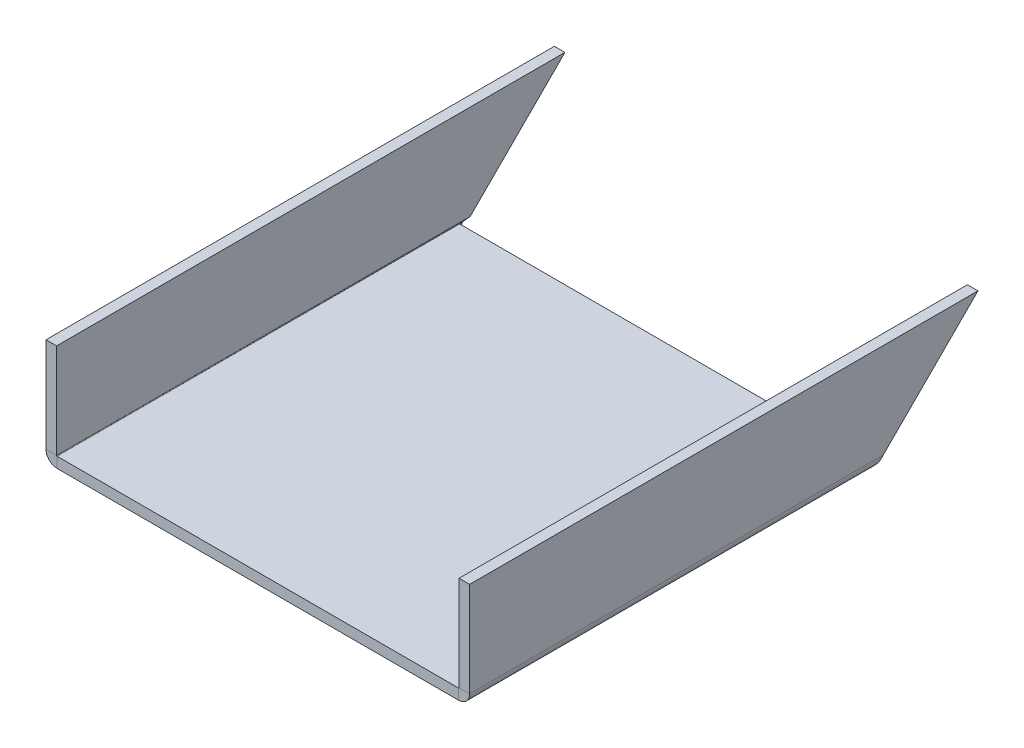
ISO-10303-21;
HEADER;
FILE_DESCRIPTION(('STEP AP214'),'2;1');
FILE_NAME('part.step','',(''),(''),'','','');
FILE_SCHEMA(('AUTOMOTIVE_DESIGN { 1 0 10303 214 1 1 1 1 }'));
ENDSEC;
DATA;
#1=APPLICATION_CONTEXT('core data for automotive mechanical design processes');
#2=APPLICATION_PROTOCOL_DEFINITION('international standard','automotive_design',2000,#1);
#3=PRODUCT_CONTEXT('',#1,'mechanical');
#4=PRODUCT('Part','Part','',(#3));
#5=PRODUCT_RELATED_PRODUCT_CATEGORY('part','',(#4));
#6=PRODUCT_DEFINITION_FORMATION('','',#4);
#7=PRODUCT_DEFINITION_CONTEXT('part definition',#1,'design');
#8=PRODUCT_DEFINITION('design','',#6,#7);
#9=PRODUCT_DEFINITION_SHAPE('','',#8);
#10=(LENGTH_UNIT() NAMED_UNIT(*) SI_UNIT(.MILLI.,.METRE.));
#11=(NAMED_UNIT(*) PLANE_ANGLE_UNIT() SI_UNIT($,.RADIAN.));
#12=(NAMED_UNIT(*) SI_UNIT($,.STERADIAN.) SOLID_ANGLE_UNIT());
#13=UNCERTAINTY_MEASURE_WITH_UNIT(LENGTH_MEASURE(1.E-05),#10,'distance_accuracy_value','');
#14=(GEOMETRIC_REPRESENTATION_CONTEXT(3) GLOBAL_UNCERTAINTY_ASSIGNED_CONTEXT((#13)) GLOBAL_UNIT_ASSIGNED_CONTEXT((#10,
#11,#12)) REPRESENTATION_CONTEXT('',''));
#15=CARTESIAN_POINT('',(0.,0.,0.));
#16=DIRECTION('',(0.,0.,1.));
#17=DIRECTION('',(1.,0.,0.));
#18=AXIS2_PLACEMENT_3D('',#15,#16,#17);
#19=CARTESIAN_POINT('',(94.6909116297961,498.,-148.));
#20=DIRECTION('',(0.,1.,0.));
#21=DIRECTION('',(-1.,0.,0.));
#22=AXIS2_PLACEMENT_3D('',#19,#20,#21);
#23=PLANE('',#22);
#24=DIRECTION('',(1.,0.,0.));
#25=VECTOR('',#24,1.);
#26=CARTESIAN_POINT('',(94.6909116297963,498.,-51.9999999999997));
#27=LINE('',#26,#25);
#28=CARTESIAN_POINT('',(288.,498.,-52.));
#29=VERTEX_POINT('',#28);
#30=CARTESIAN_POINT('',(290.,498.,-52.));
#31=VERTEX_POINT('',#30);
#32=EDGE_CURVE('E186',#29,#31,#27,.T.);
#33=ORIENTED_EDGE('',*,*,#32,.T.);
#34=DIRECTION('',(0.,0.,1.));
#35=VECTOR('',#34,1.);
#36=CARTESIAN_POINT('',(290.,498.,-148.));
#37=LINE('',#36,#35);
#38=CARTESIAN_POINT('',(290.,498.,-148.));
#39=VERTEX_POINT('',#38);
#40=EDGE_CURVE('E175',#39,#31,#37,.T.);
#41=ORIENTED_EDGE('',*,*,#40,.F.);
#42=DIRECTION('',(1.,0.,0.));
#43=VECTOR('',#42,1.);
#44=CARTESIAN_POINT('',(94.6909116297961,498.,-148.));
#45=LINE('',#44,#43);
#46=CARTESIAN_POINT('',(288.,498.,-148.));
#47=VERTEX_POINT('',#46);
#48=EDGE_CURVE('E221',#47,#39,#45,.T.);
#49=ORIENTED_EDGE('',*,*,#48,.F.);
#50=DIRECTION('',(0.,0.,1.));
#51=VECTOR('',#50,1.);
#52=CARTESIAN_POINT('',(288.,498.,-148.));
#53=LINE('',#52,#51);
#54=EDGE_CURVE('E64',#47,#29,#53,.T.);
#55=ORIENTED_EDGE('',*,*,#54,.T.);
#56=EDGE_LOOP('',(#33,#41,#49,#55));
#57=FACE_BOUND('',#56,.T.);
#58=ADVANCED_FACE('F45',(#57),#23,.T.);
#59=CARTESIAN_POINT('',(94.6909116297963,480.,-51.9999999999996));
#60=DIRECTION('',(0.,0.,1.));
#61=DIRECTION('',(0.,1.,0.));
#62=AXIS2_PLACEMENT_3D('',#59,#60,#61);
#63=PLANE('',#62);
#64=DIRECTION('',(1.,0.,0.));
#65=VECTOR('',#64,1.);
#66=CARTESIAN_POINT('',(94.6909116297963,480.1,-51.9999999999996));
#67=LINE('',#66,#65);
#68=CARTESIAN_POINT('',(288.,480.1,-51.9999999999999));
#69=VERTEX_POINT('',#68);
#70=CARTESIAN_POINT('',(290.,480.1,-51.9999999999999));
#71=VERTEX_POINT('',#70);
#72=EDGE_CURVE('E164',#69,#71,#67,.T.);
#73=ORIENTED_EDGE('',*,*,#72,.T.);
#74=DIRECTION('',(0.,1.,0.));
#75=VECTOR('',#74,1.);
#76=CARTESIAN_POINT('',(290.,478.,-51.9999999999999));
#77=LINE('',#76,#75);
#78=EDGE_CURVE('E167',#71,#31,#77,.T.);
#79=ORIENTED_EDGE('',*,*,#78,.T.);
#80=ORIENTED_EDGE('',*,*,#32,.F.);
#81=DIRECTION('',(0.,-1.,0.));
#82=VECTOR('',#81,1.);
#83=CARTESIAN_POINT('',(288.,480.,-51.9999999999999));
#84=LINE('',#83,#82);
#85=EDGE_CURVE('E169',#29,#69,#84,.T.);
#86=ORIENTED_EDGE('',*,*,#85,.T.);
#87=EDGE_LOOP('',(#73,#79,#80,#86));
#88=FACE_BOUND('',#87,.T.);
#89=ADVANCED_FACE('F165',(#88),#63,.T.);
#90=CARTESIAN_POINT('',(290.,478.,-148.));
#91=DIRECTION('',(1.,0.,0.));
#92=DIRECTION('',(0.,0.,-1.));
#93=AXIS2_PLACEMENT_3D('',#90,#91,#92);
#94=PLANE('',#93);
#95=DIRECTION('',(0.,0.,1.));
#96=VECTOR('',#95,1.);
#97=CARTESIAN_POINT('',(290.,480.1,-52.));
#98=LINE('',#97,#96);
#99=CARTESIAN_POINT('',(290.,480.1,-130.1));
#100=VERTEX_POINT('',#99);
#101=EDGE_CURVE('E87',#100,#71,#98,.T.);
#102=ORIENTED_EDGE('',*,*,#101,.F.);
#103=DIRECTION('',(0.,-0.707106781186548,0.707106781186548));
#104=VECTOR('',#103,1.);
#105=CARTESIAN_POINT('',(290.,240.,110.));
#106=LINE('',#105,#104);
#107=EDGE_CURVE('E55',#39,#100,#106,.T.);
#108=ORIENTED_EDGE('',*,*,#107,.F.);
#109=ORIENTED_EDGE('',*,*,#40,.T.);
#110=ORIENTED_EDGE('',*,*,#78,.F.);
#111=EDGE_LOOP('',(#102,#108,#109,#110));
#112=FACE_BOUND('',#111,.T.);
#113=ADVANCED_FACE('F174',(#112),#94,.T.);
#114=CARTESIAN_POINT('',(94.6909116297965,241.,109.));
#115=DIRECTION('',(0.,-0.707106781186548,-0.707106781186548));
#116=DIRECTION('',(0.,-0.707106781186548,0.707106781186548));
#117=AXIS2_PLACEMENT_3D('',#114,#115,#116);
#118=PLANE('',#117);
#119=ORIENTED_EDGE('',*,*,#48,.T.);
#120=ORIENTED_EDGE('',*,*,#107,.T.);
#121=CARTESIAN_POINT('',(288.,480.1,-130.1));
#122=CARTESIAN_POINT('',(290.,480.1,-130.1));
#123=B_SPLINE_CURVE_WITH_KNOTS('',1,(#121,#122),.UNSPECIFIED.,.F.,.F.,(2,2),(0.,1.),.UNSPECIFIED.);
#124=CARTESIAN_POINT('',(288.,480.1,-130.1));
#125=VERTEX_POINT('',#124);
#126=EDGE_CURVE('E187',#125,#100,#123,.T.);
#127=ORIENTED_EDGE('',*,*,#126,.F.);
#128=DIRECTION('',(0.,0.707106781186548,-0.707106781186548));
#129=VECTOR('',#128,1.);
#130=CARTESIAN_POINT('',(288.,241.,109.));
#131=LINE('',#130,#129);
#132=EDGE_CURVE('E12',#125,#47,#131,.T.);
#133=ORIENTED_EDGE('',*,*,#132,.T.);
#134=EDGE_LOOP('',(#119,#120,#127,#133));
#135=FACE_BOUND('',#134,.T.);
#136=ADVANCED_FACE('F476',(#135),#118,.T.);
#137=CARTESIAN_POINT('',(288.,480.,-148.));
#138=DIRECTION('',(-1.,0.,0.));
#139=DIRECTION('',(0.,0.,1.));
#140=AXIS2_PLACEMENT_3D('',#137,#138,#139);
#141=PLANE('',#140);
#142=DIRECTION('',(0.,0.,-1.));
#143=VECTOR('',#142,1.);
#144=CARTESIAN_POINT('',(288.,480.1,-52.));
#145=LINE('',#144,#143);
#146=EDGE_CURVE('E412',#69,#125,#145,.T.);
#147=ORIENTED_EDGE('',*,*,#146,.F.);
#148=ORIENTED_EDGE('',*,*,#85,.F.);
#149=ORIENTED_EDGE('',*,*,#54,.F.);
#150=ORIENTED_EDGE('',*,*,#132,.F.);
#151=EDGE_LOOP('',(#147,#148,#149,#150));
#152=FACE_BOUND('',#151,.T.);
#153=ADVANCED_FACE('F47',(#152),#141,.T.);
#154=CARTESIAN_POINT('',(405.309088370204,498.,-148.));
#155=DIRECTION('',(0.,-1.,0.));
#156=DIRECTION('',(1.,0.,0.));
#157=AXIS2_PLACEMENT_3D('',#154,#155,#156);
#158=PLANE('',#157);
#159=DIRECTION('',(0.,0.,1.));
#160=VECTOR('',#159,1.);
#161=CARTESIAN_POINT('',(210.,498.,-148.));
#162=LINE('',#161,#160);
#163=CARTESIAN_POINT('',(210.,498.,-148.));
#164=VERTEX_POINT('',#163);
#165=CARTESIAN_POINT('',(210.,498.,-52.));
#166=VERTEX_POINT('',#165);
#167=EDGE_CURVE('E307',#164,#166,#162,.T.);
#168=ORIENTED_EDGE('',*,*,#167,.T.);
#169=DIRECTION('',(-1.,0.,0.));
#170=VECTOR('',#169,1.);
#171=CARTESIAN_POINT('',(405.309088370204,498.,-51.9999999999997));
#172=LINE('',#171,#170);
#173=CARTESIAN_POINT('',(212.,498.,-52.));
#174=VERTEX_POINT('',#173);
#175=EDGE_CURVE('E300',#174,#166,#172,.T.);
#176=ORIENTED_EDGE('',*,*,#175,.F.);
#177=DIRECTION('',(0.,0.,1.));
#178=VECTOR('',#177,1.);
#179=CARTESIAN_POINT('',(212.,498.,-148.));
#180=LINE('',#179,#178);
#181=CARTESIAN_POINT('',(212.,498.,-148.));
#182=VERTEX_POINT('',#181);
#183=EDGE_CURVE('E95',#182,#174,#180,.T.);
#184=ORIENTED_EDGE('',*,*,#183,.F.);
#185=DIRECTION('',(-1.,0.,0.));
#186=VECTOR('',#185,1.);
#187=CARTESIAN_POINT('',(405.309088370204,498.,-148.));
#188=LINE('',#187,#186);
#189=EDGE_CURVE('E305',#182,#164,#188,.T.);
#190=ORIENTED_EDGE('',*,*,#189,.T.);
#191=EDGE_LOOP('',(#168,#176,#184,#190));
#192=FACE_BOUND('',#191,.T.);
#193=ADVANCED_FACE('F459',(#192),#158,.F.);
#194=CARTESIAN_POINT('',(405.309088370203,250.,100.));
#195=DIRECTION('',(0.,-0.707106781186547,-0.707106781186547));
#196=DIRECTION('',(0.,0.707106781186548,-0.707106781186548));
#197=AXIS2_PLACEMENT_3D('',#194,#195,#196);
#198=PLANE('',#197);
#199=CARTESIAN_POINT('',(210.,480.1,-130.1));
#200=CARTESIAN_POINT('',(212.,480.1,-130.1));
#201=B_SPLINE_CURVE_WITH_KNOTS('',1,(#199,#200),.UNSPECIFIED.,.F.,.F.,(2,2),(0.,1.),.UNSPECIFIED.);
#202=CARTESIAN_POINT('',(212.,480.1,-130.1));
#203=VERTEX_POINT('',#202);
#204=CARTESIAN_POINT('',(210.,480.1,-130.1));
#205=VERTEX_POINT('',#204);
#206=EDGE_CURVE('E275',#203,#205,#201,.F.);
#207=ORIENTED_EDGE('',*,*,#206,.T.);
#208=DIRECTION('',(0.,0.707106781186548,-0.707106781186548));
#209=VECTOR('',#208,1.);
#210=CARTESIAN_POINT('',(210.,250.,100.));
#211=LINE('',#210,#209);
#212=EDGE_CURVE('E270',#205,#164,#211,.T.);
#213=ORIENTED_EDGE('',*,*,#212,.T.);
#214=ORIENTED_EDGE('',*,*,#189,.F.);
#215=DIRECTION('',(0.,-0.707106781186548,0.707106781186548));
#216=VECTOR('',#215,1.);
#217=CARTESIAN_POINT('',(212.,250.,100.));
#218=LINE('',#217,#216);
#219=EDGE_CURVE('E274',#182,#203,#218,.T.);
#220=ORIENTED_EDGE('',*,*,#219,.T.);
#221=EDGE_LOOP('',(#207,#213,#214,#220));
#222=FACE_BOUND('',#221,.T.);
#223=ADVANCED_FACE('F449',(#222),#198,.T.);
#224=CARTESIAN_POINT('',(210.,498.,-148.));
#225=DIRECTION('',(-1.,0.,0.));
#226=DIRECTION('',(0.,0.,1.));
#227=AXIS2_PLACEMENT_3D('',#224,#225,#226);
#228=PLANE('',#227);
#229=DIRECTION('',(0.,0.,-1.));
#230=VECTOR('',#229,1.);
#231=CARTESIAN_POINT('',(210.,480.1,-130.1));
#232=LINE('',#231,#230);
#233=CARTESIAN_POINT('',(210.,480.1,-51.9999999999999));
#234=VERTEX_POINT('',#233);
#235=EDGE_CURVE('E119',#234,#205,#232,.T.);
#236=ORIENTED_EDGE('',*,*,#235,.F.);
#237=DIRECTION('',(0.,-1.,0.));
#238=VECTOR('',#237,1.);
#239=CARTESIAN_POINT('',(210.,498.,-51.9999999999999));
#240=LINE('',#239,#238);
#241=EDGE_CURVE('E115',#166,#234,#240,.T.);
#242=ORIENTED_EDGE('',*,*,#241,.F.);
#243=ORIENTED_EDGE('',*,*,#167,.F.);
#244=ORIENTED_EDGE('',*,*,#212,.F.);
#245=EDGE_LOOP('',(#236,#242,#243,#244));
#246=FACE_BOUND('',#245,.T.);
#247=ADVANCED_FACE('F458',(#246),#228,.T.);
#248=CARTESIAN_POINT('',(405.309088370204,498.,-51.9999999999997));
#249=DIRECTION('',(0.,0.,1.));
#250=DIRECTION('',(0.,-1.,0.));
#251=AXIS2_PLACEMENT_3D('',#248,#249,#250);
#252=PLANE('',#251);
#253=ORIENTED_EDGE('',*,*,#175,.T.);
#254=ORIENTED_EDGE('',*,*,#241,.T.);
#255=DIRECTION('',(-1.,0.,0.));
#256=VECTOR('',#255,1.);
#257=CARTESIAN_POINT('',(405.309088370204,480.1,-51.9999999999997));
#258=LINE('',#257,#256);
#259=CARTESIAN_POINT('',(212.,480.1,-51.9999999999999));
#260=VERTEX_POINT('',#259);
#261=EDGE_CURVE('E309',#260,#234,#258,.T.);
#262=ORIENTED_EDGE('',*,*,#261,.F.);
#263=DIRECTION('',(0.,1.,0.));
#264=VECTOR('',#263,1.);
#265=CARTESIAN_POINT('',(212.,498.,-51.9999999999999));
#266=LINE('',#265,#264);
#267=EDGE_CURVE('E299',#260,#174,#266,.T.);
#268=ORIENTED_EDGE('',*,*,#267,.T.);
#269=EDGE_LOOP('',(#253,#254,#262,#268));
#270=FACE_BOUND('',#269,.T.);
#271=ADVANCED_FACE('F463',(#270),#252,.T.);
#272=CARTESIAN_POINT('',(212.,498.,-148.));
#273=DIRECTION('',(1.,0.,0.));
#274=DIRECTION('',(0.,0.,-1.));
#275=AXIS2_PLACEMENT_3D('',#272,#273,#274);
#276=PLANE('',#275);
#277=DIRECTION('',(0.,0.,1.));
#278=VECTOR('',#277,1.);
#279=CARTESIAN_POINT('',(212.,480.1,-130.1));
#280=LINE('',#279,#278);
#281=EDGE_CURVE('E252',#203,#260,#280,.T.);
#282=ORIENTED_EDGE('',*,*,#281,.F.);
#283=ORIENTED_EDGE('',*,*,#219,.F.);
#284=ORIENTED_EDGE('',*,*,#183,.T.);
#285=ORIENTED_EDGE('',*,*,#267,.F.);
#286=EDGE_LOOP('',(#282,#283,#284,#285));
#287=FACE_BOUND('',#286,.T.);
#288=ADVANCED_FACE('F466',(#287),#276,.T.);
#289=CARTESIAN_POINT('',(212.,692.677805094053,-51.9999999999999));
#290=DIRECTION('',(0.,0.,1.));
#291=DIRECTION('',(1.,0.,0.));
#292=AXIS2_PLACEMENT_3D('',#289,#290,#291);
#293=PLANE('',#292);
#294=DIRECTION('',(0.,-1.,0.));
#295=VECTOR('',#294,1.);
#296=CARTESIAN_POINT('',(212.1,692.677805094053,-51.9999999999999));
#297=LINE('',#296,#295);
#298=CARTESIAN_POINT('',(212.1,480.,-51.9999999999999));
#299=VERTEX_POINT('',#298);
#300=CARTESIAN_POINT('',(212.1,478.,-51.9999999999999));
#301=VERTEX_POINT('',#300);
#302=EDGE_CURVE('E319',#299,#301,#297,.T.);
#303=ORIENTED_EDGE('',*,*,#302,.T.);
#304=DIRECTION('',(1.,0.,0.));
#305=VECTOR('',#304,1.);
#306=CARTESIAN_POINT('',(210.,478.,-51.9999999999999));
#307=LINE('',#306,#305);
#308=CARTESIAN_POINT('',(287.9,478.,-51.9999999999999));
#309=VERTEX_POINT('',#308);
#310=EDGE_CURVE('E418',#301,#309,#307,.T.);
#311=ORIENTED_EDGE('',*,*,#310,.T.);
#312=DIRECTION('',(0.,-1.,0.));
#313=VECTOR('',#312,1.);
#314=CARTESIAN_POINT('',(287.9,692.677805094053,-51.9999999999999));
#315=LINE('',#314,#313);
#316=CARTESIAN_POINT('',(287.9,480.,-51.9999999999999));
#317=VERTEX_POINT('',#316);
#318=EDGE_CURVE('E191',#317,#309,#315,.T.);
#319=ORIENTED_EDGE('',*,*,#318,.F.);
#320=DIRECTION('',(-1.,0.,0.));
#321=VECTOR('',#320,1.);
#322=CARTESIAN_POINT('',(212.,480.,-51.9999999999999));
#323=LINE('',#322,#321);
#324=EDGE_CURVE('E425',#317,#299,#323,.T.);
#325=ORIENTED_EDGE('',*,*,#324,.T.);
#326=EDGE_LOOP('',(#303,#311,#319,#325));
#327=FACE_BOUND('',#326,.T.);
#328=ADVANCED_FACE('F234',(#327),#293,.T.);
#329=CARTESIAN_POINT('',(210.,692.677805094053,-128.));
#330=DIRECTION('',(0.,0.,1.));
#331=DIRECTION('',(1.,0.,0.));
#332=AXIS2_PLACEMENT_3D('',#329,#330,#331);
#333=PLANE('',#332);
#334=DIRECTION('',(-1.,0.,0.));
#335=VECTOR('',#334,1.);
#336=CARTESIAN_POINT('',(210.,478.,-128.));
#337=LINE('',#336,#335);
#338=CARTESIAN_POINT('',(287.9,478.,-128.));
#339=VERTEX_POINT('',#338);
#340=CARTESIAN_POINT('',(212.1,478.,-128.));
#341=VERTEX_POINT('',#340);
#342=EDGE_CURVE('E256',#339,#341,#337,.T.);
#343=ORIENTED_EDGE('',*,*,#342,.T.);
#344=CARTESIAN_POINT('',(212.1,480.,-128.));
#345=CARTESIAN_POINT('',(212.1,478.,-128.));
#346=B_SPLINE_CURVE_WITH_KNOTS('',1,(#344,#345),.UNSPECIFIED.,.F.,.F.,(2,2),(0.,1.),.UNSPECIFIED.);
#347=CARTESIAN_POINT('',(212.1,480.,-128.));
#348=VERTEX_POINT('',#347);
#349=EDGE_CURVE('E430',#348,#341,#346,.T.);
#350=ORIENTED_EDGE('',*,*,#349,.F.);
#351=DIRECTION('',(-1.,0.,0.));
#352=VECTOR('',#351,1.);
#353=CARTESIAN_POINT('',(210.,480.,-128.));
#354=LINE('',#353,#352);
#355=CARTESIAN_POINT('',(287.9,480.,-128.));
#356=VERTEX_POINT('',#355);
#357=EDGE_CURVE('E428',#356,#348,#354,.T.);
#358=ORIENTED_EDGE('',*,*,#357,.F.);
#359=CARTESIAN_POINT('',(287.9,478.,-128.));
#360=CARTESIAN_POINT('',(287.9,480.,-128.));
#361=B_SPLINE_CURVE_WITH_KNOTS('',1,(#359,#360),.UNSPECIFIED.,.F.,.F.,(2,2),(0.,1.),.UNSPECIFIED.);
#362=EDGE_CURVE('E215',#356,#339,#361,.F.);
#363=ORIENTED_EDGE('',*,*,#362,.T.);
#364=EDGE_LOOP('',(#343,#350,#358,#363));
#365=FACE_BOUND('',#364,.T.);
#366=ADVANCED_FACE('F223',(#365),#333,.F.);
#367=CARTESIAN_POINT('',(212.,480.,-148.));
#368=DIRECTION('',(0.,1.,0.));
#369=DIRECTION('',(0.,0.,1.));
#370=AXIS2_PLACEMENT_3D('',#367,#368,#369);
#371=PLANE('',#370);
#372=ORIENTED_EDGE('',*,*,#324,.F.);
#373=DIRECTION('',(0.,0.,-1.));
#374=VECTOR('',#373,1.);
#375=CARTESIAN_POINT('',(287.9,480.,-51.9999999999999));
#376=LINE('',#375,#374);
#377=EDGE_CURVE('E431',#317,#356,#376,.T.);
#378=ORIENTED_EDGE('',*,*,#377,.T.);
#379=ORIENTED_EDGE('',*,*,#357,.T.);
#380=DIRECTION('',(0.,0.,1.));
#381=VECTOR('',#380,1.);
#382=CARTESIAN_POINT('',(212.1,480.,-128.));
#383=LINE('',#382,#381);
#384=EDGE_CURVE('E253',#348,#299,#383,.T.);
#385=ORIENTED_EDGE('',*,*,#384,.T.);
#386=EDGE_LOOP('',(#372,#378,#379,#385));
#387=FACE_BOUND('',#386,.T.);
#388=ADVANCED_FACE('F233',(#387),#371,.T.);
#389=CARTESIAN_POINT('',(210.,478.,-148.));
#390=DIRECTION('',(0.,-1.,0.));
#391=DIRECTION('',(0.,0.,-1.));
#392=AXIS2_PLACEMENT_3D('',#389,#390,#391);
#393=PLANE('',#392);
#394=ORIENTED_EDGE('',*,*,#342,.F.);
#395=DIRECTION('',(0.,0.,1.));
#396=VECTOR('',#395,1.);
#397=CARTESIAN_POINT('',(287.9,478.,-51.9999999999999));
#398=LINE('',#397,#396);
#399=EDGE_CURVE('E207',#339,#309,#398,.T.);
#400=ORIENTED_EDGE('',*,*,#399,.T.);
#401=ORIENTED_EDGE('',*,*,#310,.F.);
#402=DIRECTION('',(0.,0.,-1.));
#403=VECTOR('',#402,1.);
#404=CARTESIAN_POINT('',(212.1,478.,-128.));
#405=LINE('',#404,#403);
#406=EDGE_CURVE('E244',#301,#341,#405,.T.);
#407=ORIENTED_EDGE('',*,*,#406,.T.);
#408=EDGE_LOOP('',(#394,#400,#401,#407));
#409=FACE_BOUND('',#408,.T.);
#410=ADVANCED_FACE('F519',(#409),#393,.T.);
#411=CARTESIAN_POINT('',(212.1,480.1,-51.9999999999999));
#412=DIRECTION('',(0.,0.,1.));
#413=DIRECTION('',(1.,0.,0.));
#414=AXIS2_PLACEMENT_3D('',#411,#412,#413);
#415=PLANE('',#414);
#416=ORIENTED_EDGE('',*,*,#302,.F.);
#417=CARTESIAN_POINT('',(212.1,480.1,-51.9999999999999));
#418=DIRECTION('',(0.,0.,1.));
#419=DIRECTION('',(1.,0.,0.));
#420=AXIS2_PLACEMENT_3D('',#417,#418,#419);
#421=CIRCLE('',#420,0.100000000000046);
#422=EDGE_CURVE('E135',#299,#260,#421,.F.);
#423=ORIENTED_EDGE('',*,*,#422,.T.);
#424=ORIENTED_EDGE('',*,*,#261,.T.);
#425=CARTESIAN_POINT('',(212.1,480.1,-51.9999999999999));
#426=DIRECTION('',(0.,0.,1.));
#427=DIRECTION('',(1.,0.,0.));
#428=AXIS2_PLACEMENT_3D('',#425,#426,#427);
#429=CIRCLE('',#428,2.10000000000005);
#430=EDGE_CURVE('E324',#301,#234,#429,.F.);
#431=ORIENTED_EDGE('',*,*,#430,.F.);
#432=EDGE_LOOP('',(#416,#423,#424,#431));
#433=FACE_BOUND('',#432,.T.);
#434=ADVANCED_FACE('F317',(#433),#415,.T.);
#435=CARTESIAN_POINT('',(210.,480.1,-130.1));
#436=CARTESIAN_POINT('',(210.,479.825075374654,-129.924977547594));
#437=CARTESIAN_POINT('',(210.054657378996,479.550329442846,-129.75));
#438=CARTESIAN_POINT('',(210.265048584456,479.042400141221,-129.4));
#439=CARTESIAN_POINT('',(210.420699630964,478.809451888053,-129.225));
#440=CARTESIAN_POINT('',(210.809451888053,478.420699630964,-128.875));
#441=CARTESIAN_POINT('',(211.042400141221,478.265048584456,-128.7));
#442=CARTESIAN_POINT('',(211.550329442845,478.054657378996,-128.35));
#443=CARTESIAN_POINT('',(211.825075374654,478.,-128.175022452406));
#444=CARTESIAN_POINT('',(212.1,478.,-128.));
#445=CARTESIAN_POINT('',(212.,480.1,-130.1));
#446=CARTESIAN_POINT('',(212.,480.086910017479,-129.924999824448));
#447=CARTESIAN_POINT('',(212.002602732333,480.073825211564,-129.75));
#448=CARTESIAN_POINT('',(212.012621361165,480.049638101963,-129.4));
#449=CARTESIAN_POINT('',(212.02003331576,480.038545328003,-129.225));
#450=CARTESIAN_POINT('',(212.038545328002,480.02003331576,-128.875));
#451=CARTESIAN_POINT('',(212.049638101963,480.012621361165,-128.7));
#452=CARTESIAN_POINT('',(212.073825211564,480.002602732333,-128.35));
#453=CARTESIAN_POINT('',(212.086910017479,480.,-128.175000175552));
#454=CARTESIAN_POINT('',(212.1,480.,-128.));
#455=B_SPLINE_SURFACE_WITH_KNOTS('',1,3,((#435,#436,#437,#438,#439,#440,#441,#442,#443,#444),
(#445,#446,#447,#448,#449,#450,#451,#452,#453,#454)),.UNSPECIFIED.,.F.,.F.,.F.,(2,2),(4,2,2,2,
4),(0.,1.),(0.,0.25,0.5,0.75,1.),.UNSPECIFIED.);
#456=CARTESIAN_POINT('',(212.,480.1,-130.1));
#457=CARTESIAN_POINT('',(212.,480.086910017479,-129.924999824448));
#458=CARTESIAN_POINT('',(212.002602732333,480.073825211564,-129.75));
#459=CARTESIAN_POINT('',(212.012621361165,480.049638101963,-129.4));
#460=CARTESIAN_POINT('',(212.02003331576,480.038545328003,-129.225));
#461=CARTESIAN_POINT('',(212.038545328002,480.02003331576,-128.875));
#462=CARTESIAN_POINT('',(212.049638101963,480.012621361165,-128.7));
#463=CARTESIAN_POINT('',(212.073825211564,480.002602732333,-128.35));
#464=CARTESIAN_POINT('',(212.086910017479,480.,-128.175000175552));
#465=CARTESIAN_POINT('',(212.1,480.,-128.));
#466=B_SPLINE_CURVE_WITH_KNOTS('',3,(#456,#457,#458,#459,#460,#461,#462,#463,#464,#465),
.UNSPECIFIED.,.F.,.F.,(4,2,2,2,4),(0.,0.25,0.5,0.75,1.),.UNSPECIFIED.);
#467=EDGE_CURVE('E193',#203,#348,#466,.T.);
#468=CARTESIAN_POINT('',(212.1,478.,-128.));
#469=CARTESIAN_POINT('',(211.825075374654,478.,-128.175022452406));
#470=CARTESIAN_POINT('',(211.550329442845,478.054657378996,-128.35));
#471=CARTESIAN_POINT('',(211.042400141221,478.265048584456,-128.7));
#472=CARTESIAN_POINT('',(210.809451888053,478.420699630964,-128.875));
#473=CARTESIAN_POINT('',(210.420699630964,478.809451888053,-129.225));
#474=CARTESIAN_POINT('',(210.265048584456,479.042400141221,-129.4));
#475=CARTESIAN_POINT('',(210.054657378996,479.550329442846,-129.75));
#476=CARTESIAN_POINT('',(210.,479.825075374654,-129.924977547594));
#477=CARTESIAN_POINT('',(210.,480.1,-130.1));
#478=B_SPLINE_CURVE_WITH_KNOTS('',3,(#468,#469,#470,#471,#472,#473,#474,#475,#476,#477),
.UNSPECIFIED.,.F.,.F.,(4,2,2,2,4),(0.,0.25,0.5,0.75,1.),.UNSPECIFIED.);
#479=EDGE_CURVE('E321',#205,#341,#478,.F.);
#480=ORIENTED_EDGE('',*,*,#206,.F.);
#481=ORIENTED_EDGE('',*,*,#467,.T.);
#482=ORIENTED_EDGE('',*,*,#349,.T.);
#483=ORIENTED_EDGE('',*,*,#479,.F.);
#484=EDGE_LOOP('',(#480,#481,#482,#483));
#485=FACE_BOUND('',#484,.T.);
#486=ADVANCED_FACE('F349',(#485),#455,.T.);
#487=CARTESIAN_POINT('',(212.1,480.1,-278.439347883235));
#488=DIRECTION('',(0.,0.,1.));
#489=DIRECTION('',(1.,0.,0.));
#490=AXIS2_PLACEMENT_3D('',#487,#488,#489);
#491=CYLINDRICAL_SURFACE('',#490,2.10000000000005);
#492=ORIENTED_EDGE('',*,*,#479,.T.);
#493=ORIENTED_EDGE('',*,*,#406,.F.);
#494=ORIENTED_EDGE('',*,*,#430,.T.);
#495=ORIENTED_EDGE('',*,*,#235,.T.);
#496=EDGE_LOOP('',(#492,#493,#494,#495));
#497=FACE_BOUND('',#496,.T.);
#498=ADVANCED_FACE('F340',(#497),#491,.T.);
#499=CARTESIAN_POINT('',(212.1,480.1,-278.439347883235));
#500=DIRECTION('',(0.,0.,1.));
#501=DIRECTION('',(1.,0.,0.));
#502=AXIS2_PLACEMENT_3D('',#499,#500,#501);
#503=CYLINDRICAL_SURFACE('',#502,0.100000000000046);
#504=ORIENTED_EDGE('',*,*,#467,.F.);
#505=ORIENTED_EDGE('',*,*,#281,.T.);
#506=ORIENTED_EDGE('',*,*,#422,.F.);
#507=ORIENTED_EDGE('',*,*,#384,.F.);
#508=EDGE_LOOP('',(#504,#505,#506,#507));
#509=FACE_BOUND('',#508,.T.);
#510=ADVANCED_FACE('F314',(#509),#503,.F.);
#511=CARTESIAN_POINT('',(287.9,478.,-128.));
#512=CARTESIAN_POINT('',(288.174924625346,478.,-128.175022452406));
#513=CARTESIAN_POINT('',(288.449670557155,478.054657378997,-128.35));
#514=CARTESIAN_POINT('',(288.957599858779,478.265048584456,-128.7));
#515=CARTESIAN_POINT('',(289.190548111947,478.420699630964,-128.875));
#516=CARTESIAN_POINT('',(289.579300369036,478.809451888053,-129.225));
#517=CARTESIAN_POINT('',(289.734951415544,479.042400141221,-129.4));
#518=CARTESIAN_POINT('',(289.945342621004,479.550329442846,-129.75));
#519=CARTESIAN_POINT('',(290.,479.825075374654,-129.924977547594));
#520=CARTESIAN_POINT('',(290.,480.1,-130.1));
#521=CARTESIAN_POINT('',(287.9,480.,-128.));
#522=CARTESIAN_POINT('',(287.913089982521,480.,-128.175000175552));
#523=CARTESIAN_POINT('',(287.926174788436,480.002602732333,-128.35));
#524=CARTESIAN_POINT('',(287.950361898037,480.012621361165,-128.7));
#525=CARTESIAN_POINT('',(287.961454671997,480.02003331576,-128.875));
#526=CARTESIAN_POINT('',(287.97996668424,480.038545328003,-129.225));
#527=CARTESIAN_POINT('',(287.987378638835,480.049638101963,-129.4));
#528=CARTESIAN_POINT('',(287.997397267667,480.073825211564,-129.75));
#529=CARTESIAN_POINT('',(288.,480.086910017479,-129.924999824448));
#530=CARTESIAN_POINT('',(288.,480.1,-130.1));
#531=B_SPLINE_SURFACE_WITH_KNOTS('',1,3,((#511,#512,#513,#514,#515,#516,#517,#518,#519,#520),
(#521,#522,#523,#524,#525,#526,#527,#528,#529,#530)),.UNSPECIFIED.,.F.,.F.,.F.,(2,2),(4,2,2,2,
4),(0.,1.),(0.,0.25,0.5,0.75,1.),.UNSPECIFIED.);
#532=CARTESIAN_POINT('',(287.9,480.,-128.));
#533=CARTESIAN_POINT('',(287.913089982521,480.,-128.175000175552));
#534=CARTESIAN_POINT('',(287.926174788436,480.002602732333,-128.35));
#535=CARTESIAN_POINT('',(287.950361898037,480.012621361165,-128.7));
#536=CARTESIAN_POINT('',(287.961454671997,480.02003331576,-128.875));
#537=CARTESIAN_POINT('',(287.97996668424,480.038545328003,-129.225));
#538=CARTESIAN_POINT('',(287.987378638835,480.049638101963,-129.4));
#539=CARTESIAN_POINT('',(287.997397267667,480.073825211564,-129.75));
#540=CARTESIAN_POINT('',(288.,480.086910017479,-129.924999824448));
#541=CARTESIAN_POINT('',(288.,480.1,-130.1));
#542=B_SPLINE_CURVE_WITH_KNOTS('',3,(#532,#533,#534,#535,#536,#537,#538,#539,#540,#541),
.UNSPECIFIED.,.F.,.F.,(4,2,2,2,4),(0.,0.25,0.5,0.75,1.),.UNSPECIFIED.);
#543=EDGE_CURVE('E126',#356,#125,#542,.T.);
#544=CARTESIAN_POINT('',(290.,480.1,-130.1));
#545=CARTESIAN_POINT('',(290.,479.825075374654,-129.924977547594));
#546=CARTESIAN_POINT('',(289.945342621004,479.550329442846,-129.75));
#547=CARTESIAN_POINT('',(289.734951415544,479.042400141221,-129.4));
#548=CARTESIAN_POINT('',(289.579300369036,478.809451888053,-129.225));
#549=CARTESIAN_POINT('',(289.190548111947,478.420699630964,-128.875));
#550=CARTESIAN_POINT('',(288.957599858779,478.265048584456,-128.7));
#551=CARTESIAN_POINT('',(288.449670557155,478.054657378997,-128.35));
#552=CARTESIAN_POINT('',(288.174924625346,478.,-128.175022452406));
#553=CARTESIAN_POINT('',(287.9,478.,-128.));
#554=B_SPLINE_CURVE_WITH_KNOTS('',3,(#544,#545,#546,#547,#548,#549,#550,#551,#552,#553),
.UNSPECIFIED.,.F.,.F.,(4,2,2,2,4),(0.,0.25,0.5,0.75,1.),.UNSPECIFIED.);
#555=EDGE_CURVE('E184',#339,#100,#554,.F.);
#556=ORIENTED_EDGE('',*,*,#362,.F.);
#557=ORIENTED_EDGE('',*,*,#543,.T.);
#558=ORIENTED_EDGE('',*,*,#126,.T.);
#559=ORIENTED_EDGE('',*,*,#555,.F.);
#560=EDGE_LOOP('',(#556,#557,#558,#559));
#561=FACE_BOUND('',#560,.T.);
#562=ADVANCED_FACE('F350',(#561),#531,.T.);
#563=CARTESIAN_POINT('',(287.9,480.1,-51.9999999999999));
#564=DIRECTION('',(0.,0.,1.));
#565=DIRECTION('',(0.,-1.,0.));
#566=AXIS2_PLACEMENT_3D('',#563,#564,#565);
#567=PLANE('',#566);
#568=ORIENTED_EDGE('',*,*,#72,.F.);
#569=CARTESIAN_POINT('',(287.9,480.1,-51.9999999999999));
#570=DIRECTION('',(0.,0.,-1.));
#571=DIRECTION('',(-1.,0.,0.));
#572=AXIS2_PLACEMENT_3D('',#569,#570,#571);
#573=CIRCLE('',#572,0.0999999999999696);
#574=EDGE_CURVE('E194',#69,#317,#573,.T.);
#575=ORIENTED_EDGE('',*,*,#574,.T.);
#576=ORIENTED_EDGE('',*,*,#318,.T.);
#577=CARTESIAN_POINT('',(287.9,480.1,-51.9999999999999));
#578=DIRECTION('',(0.,0.,-1.));
#579=DIRECTION('',(-1.,0.,0.));
#580=AXIS2_PLACEMENT_3D('',#577,#578,#579);
#581=CIRCLE('',#580,2.09999999999997);
#582=EDGE_CURVE('E182',#71,#309,#581,.T.);
#583=ORIENTED_EDGE('',*,*,#582,.F.);
#584=EDGE_LOOP('',(#568,#575,#576,#583));
#585=FACE_BOUND('',#584,.T.);
#586=ADVANCED_FACE('F189',(#585),#567,.T.);
#587=CARTESIAN_POINT('',(287.9,480.1,85.6544313880076));
#588=DIRECTION('',(0.,0.,-1.));
#589=DIRECTION('',(-1.,0.,0.));
#590=AXIS2_PLACEMENT_3D('',#587,#588,#589);
#591=CYLINDRICAL_SURFACE('',#590,2.09999999999997);
#592=ORIENTED_EDGE('',*,*,#582,.T.);
#593=ORIENTED_EDGE('',*,*,#399,.F.);
#594=ORIENTED_EDGE('',*,*,#555,.T.);
#595=ORIENTED_EDGE('',*,*,#101,.T.);
#596=EDGE_LOOP('',(#592,#593,#594,#595));
#597=FACE_BOUND('',#596,.T.);
#598=ADVANCED_FACE('F180',(#597),#591,.T.);
#599=CARTESIAN_POINT('',(287.9,480.1,85.6544313880076));
#600=DIRECTION('',(0.,0.,-1.));
#601=DIRECTION('',(-1.,0.,0.));
#602=AXIS2_PLACEMENT_3D('',#599,#600,#601);
#603=CYLINDRICAL_SURFACE('',#602,0.0999999999999696);
#604=ORIENTED_EDGE('',*,*,#574,.F.);
#605=ORIENTED_EDGE('',*,*,#146,.T.);
#606=ORIENTED_EDGE('',*,*,#543,.F.);
#607=ORIENTED_EDGE('',*,*,#377,.F.);
#608=EDGE_LOOP('',(#604,#605,#606,#607));
#609=FACE_BOUND('',#608,.T.);
#610=ADVANCED_FACE('F593',(#609),#603,.F.);
#611=CLOSED_SHELL('',(#58,#89,#113,#136,#153,#193,#223,#247,#271,#288,#328,#366,#388,#410,#434,
#486,#498,#510,#562,#586,#598,#610));
#612=MANIFOLD_SOLID_BREP('B2',#611);
#613=ADVANCED_BREP_SHAPE_REPRESENTATION('',(#18,#612),#14);
#614=SHAPE_DEFINITION_REPRESENTATION(#9,#613);
ENDSEC;
END-ISO-10303-21;
